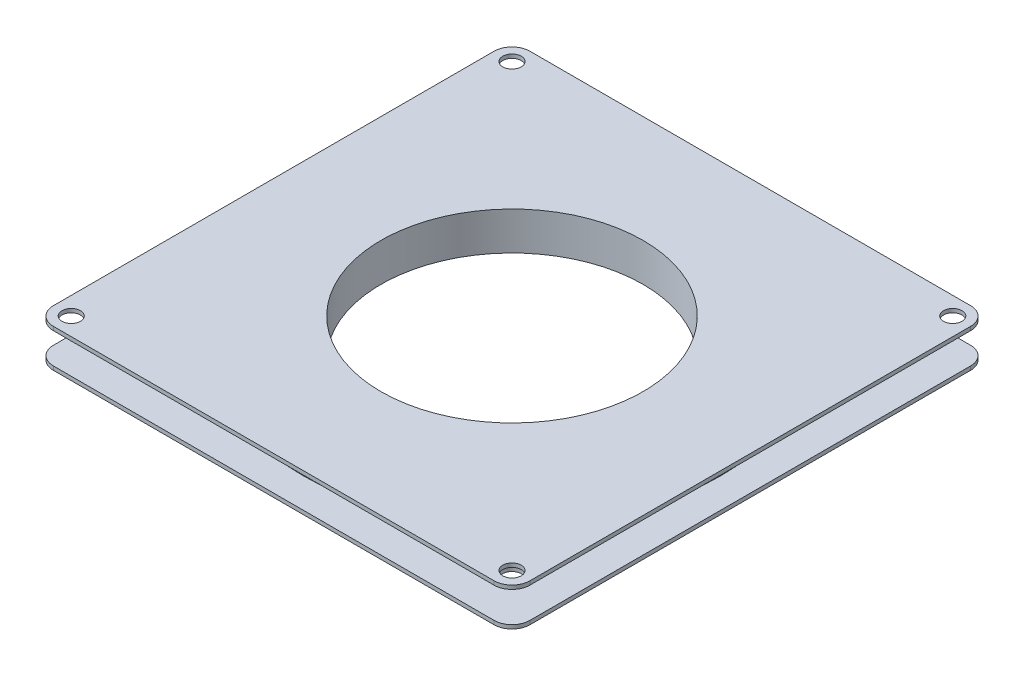
ISO-10303-21;
HEADER;
FILE_DESCRIPTION(('STEP AP214'),'2;1');
FILE_NAME('part.step','',(''),(''),'','','');
FILE_SCHEMA(('AUTOMOTIVE_DESIGN { 1 0 10303 214 1 1 1 1 }'));
ENDSEC;
DATA;
#1=APPLICATION_CONTEXT('core data for automotive mechanical design processes');
#2=APPLICATION_PROTOCOL_DEFINITION('international standard','automotive_design',2000,#1);
#3=PRODUCT_CONTEXT('',#1,'mechanical');
#4=PRODUCT('Part','Part','',(#3));
#5=PRODUCT_RELATED_PRODUCT_CATEGORY('part','',(#4));
#6=PRODUCT_DEFINITION_FORMATION('','',#4);
#7=PRODUCT_DEFINITION_CONTEXT('part definition',#1,'design');
#8=PRODUCT_DEFINITION('design','',#6,#7);
#9=PRODUCT_DEFINITION_SHAPE('','',#8);
#10=(LENGTH_UNIT() NAMED_UNIT(*) SI_UNIT(.MILLI.,.METRE.));
#11=(NAMED_UNIT(*) PLANE_ANGLE_UNIT() SI_UNIT($,.RADIAN.));
#12=(NAMED_UNIT(*) SI_UNIT($,.STERADIAN.) SOLID_ANGLE_UNIT());
#13=UNCERTAINTY_MEASURE_WITH_UNIT(LENGTH_MEASURE(1.E-05),#10,'distance_accuracy_value','');
#14=(GEOMETRIC_REPRESENTATION_CONTEXT(3) GLOBAL_UNCERTAINTY_ASSIGNED_CONTEXT((#13)) GLOBAL_UNIT_ASSIGNED_CONTEXT((#10,
#11,#12)) REPRESENTATION_CONTEXT('',''));
#15=CARTESIAN_POINT('',(0.,0.,0.));
#16=DIRECTION('',(0.,0.,1.));
#17=DIRECTION('',(1.,0.,0.));
#18=AXIS2_PLACEMENT_3D('',#15,#16,#17);
#19=CARTESIAN_POINT('',(0.,0.8128,0.));
#20=DIRECTION('',(0.,-1.,0.));
#21=DIRECTION('',(0.,0.,-1.));
#22=AXIS2_PLACEMENT_3D('',#19,#20,#21);
#23=PLANE('',#22);
#24=CARTESIAN_POINT('',(91.2495,0.8128,-10.3505));
#25=DIRECTION('',(0.,1.,0.));
#26=DIRECTION('',(0.,0.,1.));
#27=AXIS2_PLACEMENT_3D('',#24,#25,#26);
#28=CIRCLE('',#27,1.9685);
#29=CARTESIAN_POINT('',(91.2495,0.8128,-8.382));
#30=VERTEX_POINT('',#29);
#31=EDGE_CURVE('E231',#30,#30,#28,.T.);
#32=ORIENTED_EDGE('',*,*,#31,.F.);
#33=EDGE_LOOP('',(#32));
#34=FACE_BOUND('',#33,.T.);
#35=CARTESIAN_POINT('',(10.3505,0.8128,-10.3505));
#36=DIRECTION('',(0.,1.,0.));
#37=DIRECTION('',(0.,0.,1.));
#38=AXIS2_PLACEMENT_3D('',#35,#36,#37);
#39=CIRCLE('',#38,1.9685);
#40=CARTESIAN_POINT('',(10.3505,0.8128,-8.382));
#41=VERTEX_POINT('',#40);
#42=EDGE_CURVE('E243',#41,#41,#39,.T.);
#43=ORIENTED_EDGE('',*,*,#42,.F.);
#44=EDGE_LOOP('',(#43));
#45=FACE_BOUND('',#44,.T.);
#46=DIRECTION('',(1.,0.,0.));
#47=VECTOR('',#46,1.);
#48=CARTESIAN_POINT('',(0.,0.8128,0.));
#49=LINE('',#48,#47);
#50=CARTESIAN_POINT('',(3.81,0.8128,0.));
#51=VERTEX_POINT('',#50);
#52=CARTESIAN_POINT('',(97.79,0.8128,0.));
#53=VERTEX_POINT('',#52);
#54=EDGE_CURVE('E252',#51,#53,#49,.T.);
#55=ORIENTED_EDGE('',*,*,#54,.T.);
#56=CARTESIAN_POINT('',(97.79,0.8128,-3.81));
#57=DIRECTION('',(0.,-1.,0.));
#58=DIRECTION('',(0.,0.,-1.));
#59=AXIS2_PLACEMENT_3D('',#56,#57,#58);
#60=CIRCLE('',#59,3.81);
#61=CARTESIAN_POINT('',(101.6,0.8128,-3.81));
#62=VERTEX_POINT('',#61);
#63=EDGE_CURVE('E292',#53,#62,#60,.F.);
#64=ORIENTED_EDGE('',*,*,#63,.T.);
#65=DIRECTION('',(0.,0.,-1.));
#66=VECTOR('',#65,1.);
#67=CARTESIAN_POINT('',(101.6,0.8128,0.));
#68=LINE('',#67,#66);
#69=CARTESIAN_POINT('',(101.6,0.8128,-97.79));
#70=VERTEX_POINT('',#69);
#71=EDGE_CURVE('E256',#62,#70,#68,.T.);
#72=ORIENTED_EDGE('',*,*,#71,.T.);
#73=CARTESIAN_POINT('',(97.79,0.8128,-97.79));
#74=DIRECTION('',(0.,-1.,0.));
#75=DIRECTION('',(0.,0.,-1.));
#76=AXIS2_PLACEMENT_3D('',#73,#74,#75);
#77=CIRCLE('',#76,3.81);
#78=CARTESIAN_POINT('',(97.79,0.8128,-101.6));
#79=VERTEX_POINT('',#78);
#80=EDGE_CURVE('E61',#70,#79,#77,.F.);
#81=ORIENTED_EDGE('',*,*,#80,.T.);
#82=DIRECTION('',(-1.,0.,0.));
#83=VECTOR('',#82,1.);
#84=CARTESIAN_POINT('',(0.,0.8128,-101.6));
#85=LINE('',#84,#83);
#86=CARTESIAN_POINT('',(3.81,0.8128,-101.6));
#87=VERTEX_POINT('',#86);
#88=EDGE_CURVE('E258',#79,#87,#85,.T.);
#89=ORIENTED_EDGE('',*,*,#88,.T.);
#90=CARTESIAN_POINT('',(3.81,0.8128,-97.79));
#91=DIRECTION('',(0.,-1.,0.));
#92=DIRECTION('',(0.,0.,-1.));
#93=AXIS2_PLACEMENT_3D('',#90,#91,#92);
#94=CIRCLE('',#93,3.81);
#95=CARTESIAN_POINT('',(0.,0.8128,-97.79));
#96=VERTEX_POINT('',#95);
#97=EDGE_CURVE('E289',#87,#96,#94,.F.);
#98=ORIENTED_EDGE('',*,*,#97,.T.);
#99=DIRECTION('',(0.,0.,1.));
#100=VECTOR('',#99,1.);
#101=CARTESIAN_POINT('',(0.,0.8128,0.));
#102=LINE('',#101,#100);
#103=CARTESIAN_POINT('',(0.,0.8128,-3.81));
#104=VERTEX_POINT('',#103);
#105=EDGE_CURVE('E249',#96,#104,#102,.T.);
#106=ORIENTED_EDGE('',*,*,#105,.T.);
#107=CARTESIAN_POINT('',(3.81,0.8128,-3.81));
#108=DIRECTION('',(0.,-1.,0.));
#109=DIRECTION('',(0.,0.,-1.));
#110=AXIS2_PLACEMENT_3D('',#107,#108,#109);
#111=CIRCLE('',#110,3.81);
#112=EDGE_CURVE('E287',#104,#51,#111,.F.);
#113=ORIENTED_EDGE('',*,*,#112,.T.);
#114=EDGE_LOOP('',(#55,#64,#72,#81,#89,#98,#106,#113));
#115=FACE_BOUND('',#114,.T.);
#116=CARTESIAN_POINT('',(10.3505,0.8128,-91.2495));
#117=DIRECTION('',(0.,1.,0.));
#118=DIRECTION('',(0.,0.,1.));
#119=AXIS2_PLACEMENT_3D('',#116,#117,#118);
#120=CIRCLE('',#119,1.96850000000001);
#121=CARTESIAN_POINT('',(10.3505,0.8128,-89.281));
#122=VERTEX_POINT('',#121);
#123=EDGE_CURVE('E237',#122,#122,#120,.T.);
#124=ORIENTED_EDGE('',*,*,#123,.F.);
#125=EDGE_LOOP('',(#124));
#126=FACE_BOUND('',#125,.T.);
#127=CARTESIAN_POINT('',(91.2495,0.8128,-91.2495));
#128=DIRECTION('',(0.,1.,0.));
#129=DIRECTION('',(0.,0.,1.));
#130=AXIS2_PLACEMENT_3D('',#127,#128,#129);
#131=CIRCLE('',#130,1.9685);
#132=CARTESIAN_POINT('',(91.2495,0.8128,-89.281));
#133=VERTEX_POINT('',#132);
#134=EDGE_CURVE('E225',#133,#133,#131,.T.);
#135=ORIENTED_EDGE('',*,*,#134,.F.);
#136=EDGE_LOOP('',(#135));
#137=FACE_BOUND('',#136,.T.);
#138=CARTESIAN_POINT('',(50.8,0.812800000005609,-50.8));
#139=DIRECTION('',(0.,-1.,0.));
#140=DIRECTION('',(0.,0.,-1.));
#141=AXIS2_PLACEMENT_3D('',#138,#139,#140);
#142=CIRCLE('',#141,44.45);
#143=CARTESIAN_POINT('',(50.8,0.812800000005609,-95.25));
#144=VERTEX_POINT('',#143);
#145=EDGE_CURVE('E12',#144,#144,#142,.F.);
#146=ORIENTED_EDGE('',*,*,#145,.F.);
#147=EDGE_LOOP('',(#146));
#148=FACE_BOUND('',#147,.T.);
#149=ADVANCED_FACE('F39',(#34,#45,#115,#126,#137,#148),#23,.F.);
#150=CARTESIAN_POINT('',(0.,0.,0.));
#151=DIRECTION('',(0.,-1.,0.));
#152=DIRECTION('',(0.,0.,-1.));
#153=AXIS2_PLACEMENT_3D('',#150,#151,#152);
#154=PLANE('',#153);
#155=CARTESIAN_POINT('',(91.2495,0.,-91.2495));
#156=DIRECTION('',(0.,1.,0.));
#157=DIRECTION('',(0.,0.,1.));
#158=AXIS2_PLACEMENT_3D('',#155,#156,#157);
#159=CIRCLE('',#158,1.9685);
#160=CARTESIAN_POINT('',(91.2495,0.,-89.281));
#161=VERTEX_POINT('',#160);
#162=EDGE_CURVE('E224',#161,#161,#159,.T.);
#163=ORIENTED_EDGE('',*,*,#162,.T.);
#164=EDGE_LOOP('',(#163));
#165=FACE_BOUND('',#164,.T.);
#166=CARTESIAN_POINT('',(10.3505,0.,-91.2495));
#167=DIRECTION('',(0.,1.,0.));
#168=DIRECTION('',(0.,0.,1.));
#169=AXIS2_PLACEMENT_3D('',#166,#167,#168);
#170=CIRCLE('',#169,1.96850000000001);
#171=CARTESIAN_POINT('',(10.3505,0.,-89.281));
#172=VERTEX_POINT('',#171);
#173=EDGE_CURVE('E234',#172,#172,#170,.T.);
#174=ORIENTED_EDGE('',*,*,#173,.T.);
#175=EDGE_LOOP('',(#174));
#176=FACE_BOUND('',#175,.T.);
#177=DIRECTION('',(0.,0.,-1.));
#178=VECTOR('',#177,1.);
#179=CARTESIAN_POINT('',(101.6,0.,0.));
#180=LINE('',#179,#178);
#181=CARTESIAN_POINT('',(101.6,0.,-3.81));
#182=VERTEX_POINT('',#181);
#183=CARTESIAN_POINT('',(101.6,0.,-97.79));
#184=VERTEX_POINT('',#183);
#185=EDGE_CURVE('E266',#182,#184,#180,.T.);
#186=ORIENTED_EDGE('',*,*,#185,.F.);
#187=CARTESIAN_POINT('',(97.79,0.,-3.81));
#188=DIRECTION('',(0.,-1.,0.));
#189=DIRECTION('',(0.,0.,-1.));
#190=AXIS2_PLACEMENT_3D('',#187,#188,#189);
#191=CIRCLE('',#190,3.81);
#192=CARTESIAN_POINT('',(97.79,0.,0.));
#193=VERTEX_POINT('',#192);
#194=EDGE_CURVE('E280',#182,#193,#191,.T.);
#195=ORIENTED_EDGE('',*,*,#194,.T.);
#196=DIRECTION('',(1.,0.,0.));
#197=VECTOR('',#196,1.);
#198=CARTESIAN_POINT('',(0.,0.,0.));
#199=LINE('',#198,#197);
#200=CARTESIAN_POINT('',(3.81,0.,0.));
#201=VERTEX_POINT('',#200);
#202=EDGE_CURVE('E263',#201,#193,#199,.T.);
#203=ORIENTED_EDGE('',*,*,#202,.F.);
#204=CARTESIAN_POINT('',(3.81,0.,-3.81));
#205=DIRECTION('',(0.,-1.,0.));
#206=DIRECTION('',(0.,0.,-1.));
#207=AXIS2_PLACEMENT_3D('',#204,#205,#206);
#208=CIRCLE('',#207,3.81);
#209=CARTESIAN_POINT('',(0.,0.,-3.81));
#210=VERTEX_POINT('',#209);
#211=EDGE_CURVE('E274',#201,#210,#208,.T.);
#212=ORIENTED_EDGE('',*,*,#211,.T.);
#213=DIRECTION('',(0.,0.,1.));
#214=VECTOR('',#213,1.);
#215=CARTESIAN_POINT('',(0.,0.,0.));
#216=LINE('',#215,#214);
#217=CARTESIAN_POINT('',(0.,0.,-97.79));
#218=VERTEX_POINT('',#217);
#219=EDGE_CURVE('E246',#218,#210,#216,.T.);
#220=ORIENTED_EDGE('',*,*,#219,.F.);
#221=CARTESIAN_POINT('',(3.81,0.,-97.79));
#222=DIRECTION('',(0.,-1.,0.));
#223=DIRECTION('',(0.,0.,-1.));
#224=AXIS2_PLACEMENT_3D('',#221,#222,#223);
#225=CIRCLE('',#224,3.81);
#226=CARTESIAN_POINT('',(3.81,0.,-101.6));
#227=VERTEX_POINT('',#226);
#228=EDGE_CURVE('E276',#218,#227,#225,.T.);
#229=ORIENTED_EDGE('',*,*,#228,.T.);
#230=DIRECTION('',(-1.,0.,0.));
#231=VECTOR('',#230,1.);
#232=CARTESIAN_POINT('',(0.,0.,-101.6));
#233=LINE('',#232,#231);
#234=CARTESIAN_POINT('',(97.79,0.,-101.6));
#235=VERTEX_POINT('',#234);
#236=EDGE_CURVE('E253',#235,#227,#233,.T.);
#237=ORIENTED_EDGE('',*,*,#236,.F.);
#238=CARTESIAN_POINT('',(97.79,0.,-97.79));
#239=DIRECTION('',(0.,-1.,0.));
#240=DIRECTION('',(0.,0.,-1.));
#241=AXIS2_PLACEMENT_3D('',#238,#239,#240);
#242=CIRCLE('',#241,3.81);
#243=EDGE_CURVE('E278',#235,#184,#242,.T.);
#244=ORIENTED_EDGE('',*,*,#243,.T.);
#245=EDGE_LOOP('',(#186,#195,#203,#212,#220,#229,#237,#244));
#246=FACE_BOUND('',#245,.T.);
#247=CARTESIAN_POINT('',(10.3505,0.,-10.3505));
#248=DIRECTION('',(0.,1.,0.));
#249=DIRECTION('',(0.,0.,1.));
#250=AXIS2_PLACEMENT_3D('',#247,#248,#249);
#251=CIRCLE('',#250,1.9685);
#252=CARTESIAN_POINT('',(10.3505,0.,-8.382));
#253=VERTEX_POINT('',#252);
#254=EDGE_CURVE('E240',#253,#253,#251,.T.);
#255=ORIENTED_EDGE('',*,*,#254,.T.);
#256=EDGE_LOOP('',(#255));
#257=FACE_BOUND('',#256,.T.);
#258=CARTESIAN_POINT('',(91.2495,0.,-10.3505));
#259=DIRECTION('',(0.,1.,0.));
#260=DIRECTION('',(0.,0.,1.));
#261=AXIS2_PLACEMENT_3D('',#258,#259,#260);
#262=CIRCLE('',#261,1.9685);
#263=CARTESIAN_POINT('',(91.2495,0.,-8.382));
#264=VERTEX_POINT('',#263);
#265=EDGE_CURVE('E228',#264,#264,#262,.T.);
#266=ORIENTED_EDGE('',*,*,#265,.T.);
#267=EDGE_LOOP('',(#266));
#268=FACE_BOUND('',#267,.T.);
#269=CARTESIAN_POINT('',(50.8,0.,-50.8));
#270=DIRECTION('',(0.,1.,0.));
#271=DIRECTION('',(0.,0.,1.));
#272=AXIS2_PLACEMENT_3D('',#269,#270,#271);
#273=CIRCLE('',#272,27.94);
#274=CARTESIAN_POINT('',(50.8,0.,-22.86));
#275=VERTEX_POINT('',#274);
#276=EDGE_CURVE('E221',#275,#275,#273,.T.);
#277=ORIENTED_EDGE('',*,*,#276,.T.);
#278=EDGE_LOOP('',(#277));
#279=FACE_BOUND('',#278,.T.);
#280=ADVANCED_FACE('F310',(#165,#176,#246,#257,#268,#279),#154,.T.);
#281=CARTESIAN_POINT('',(0.,0.8128,0.));
#282=DIRECTION('',(1.,0.,0.));
#283=DIRECTION('',(0.,0.,-1.));
#284=AXIS2_PLACEMENT_3D('',#281,#282,#283);
#285=PLANE('',#284);
#286=ORIENTED_EDGE('',*,*,#105,.F.);
#287=DIRECTION('',(0.,-1.,0.));
#288=VECTOR('',#287,1.);
#289=CARTESIAN_POINT('',(0.,0.8128,-97.79));
#290=LINE('',#289,#288);
#291=EDGE_CURVE('E47',#96,#218,#290,.T.);
#292=ORIENTED_EDGE('',*,*,#291,.T.);
#293=ORIENTED_EDGE('',*,*,#219,.T.);
#294=DIRECTION('',(0.,-1.,0.));
#295=VECTOR('',#294,1.);
#296=CARTESIAN_POINT('',(0.,0.8128,-3.81));
#297=LINE('',#296,#295);
#298=EDGE_CURVE('E298',#210,#104,#297,.F.);
#299=ORIENTED_EDGE('',*,*,#298,.T.);
#300=EDGE_LOOP('',(#286,#292,#293,#299));
#301=FACE_BOUND('',#300,.T.);
#302=ADVANCED_FACE('F304',(#301),#285,.F.);
#303=CARTESIAN_POINT('',(0.,0.8128,0.));
#304=DIRECTION('',(0.,0.,-1.));
#305=DIRECTION('',(-1.,0.,0.));
#306=AXIS2_PLACEMENT_3D('',#303,#304,#305);
#307=PLANE('',#306);
#308=ORIENTED_EDGE('',*,*,#202,.T.);
#309=DIRECTION('',(0.,-1.,0.));
#310=VECTOR('',#309,1.);
#311=CARTESIAN_POINT('',(97.79,0.8128,0.));
#312=LINE('',#311,#310);
#313=EDGE_CURVE('E285',#193,#53,#312,.F.);
#314=ORIENTED_EDGE('',*,*,#313,.T.);
#315=ORIENTED_EDGE('',*,*,#54,.F.);
#316=DIRECTION('',(0.,-1.,0.));
#317=VECTOR('',#316,1.);
#318=CARTESIAN_POINT('',(3.81,0.8128,0.));
#319=LINE('',#318,#317);
#320=EDGE_CURVE('E282',#51,#201,#319,.T.);
#321=ORIENTED_EDGE('',*,*,#320,.T.);
#322=EDGE_LOOP('',(#308,#314,#315,#321));
#323=FACE_BOUND('',#322,.T.);
#324=ADVANCED_FACE('F319',(#323),#307,.F.);
#325=CARTESIAN_POINT('',(101.6,0.8128,0.));
#326=DIRECTION('',(-1.,0.,0.));
#327=DIRECTION('',(0.,0.,1.));
#328=AXIS2_PLACEMENT_3D('',#325,#326,#327);
#329=PLANE('',#328);
#330=ORIENTED_EDGE('',*,*,#71,.F.);
#331=DIRECTION('',(0.,-1.,0.));
#332=VECTOR('',#331,1.);
#333=CARTESIAN_POINT('',(101.6,0.8128,-3.81));
#334=LINE('',#333,#332);
#335=EDGE_CURVE('E271',#62,#182,#334,.T.);
#336=ORIENTED_EDGE('',*,*,#335,.T.);
#337=ORIENTED_EDGE('',*,*,#185,.T.);
#338=DIRECTION('',(0.,-1.,0.));
#339=VECTOR('',#338,1.);
#340=CARTESIAN_POINT('',(101.6,0.8128,-97.79));
#341=LINE('',#340,#339);
#342=EDGE_CURVE('E260',#184,#70,#341,.F.);
#343=ORIENTED_EDGE('',*,*,#342,.T.);
#344=EDGE_LOOP('',(#330,#336,#337,#343));
#345=FACE_BOUND('',#344,.T.);
#346=ADVANCED_FACE('F328',(#345),#329,.F.);
#347=CARTESIAN_POINT('',(0.,0.8128,-101.6));
#348=DIRECTION('',(0.,0.,1.));
#349=DIRECTION('',(1.,0.,0.));
#350=AXIS2_PLACEMENT_3D('',#347,#348,#349);
#351=PLANE('',#350);
#352=ORIENTED_EDGE('',*,*,#88,.F.);
#353=DIRECTION('',(0.,-1.,0.));
#354=VECTOR('',#353,1.);
#355=CARTESIAN_POINT('',(97.79,0.8128,-101.6));
#356=LINE('',#355,#354);
#357=EDGE_CURVE('E295',#79,#235,#356,.T.);
#358=ORIENTED_EDGE('',*,*,#357,.T.);
#359=ORIENTED_EDGE('',*,*,#236,.T.);
#360=DIRECTION('',(0.,-1.,0.));
#361=VECTOR('',#360,1.);
#362=CARTESIAN_POINT('',(3.81,0.8128,-101.6));
#363=LINE('',#362,#361);
#364=EDGE_CURVE('E54',#227,#87,#363,.F.);
#365=ORIENTED_EDGE('',*,*,#364,.T.);
#366=EDGE_LOOP('',(#352,#358,#359,#365));
#367=FACE_BOUND('',#366,.T.);
#368=ADVANCED_FACE('F333',(#367),#351,.F.);
#369=CARTESIAN_POINT('',(10.3505,0.8128,-10.3505));
#370=DIRECTION('',(0.,-1.,0.));
#371=DIRECTION('',(0.,0.,-1.));
#372=AXIS2_PLACEMENT_3D('',#369,#370,#371);
#373=CYLINDRICAL_SURFACE('',#372,1.9685);
#374=ORIENTED_EDGE('',*,*,#42,.T.);
#375=EDGE_LOOP('',(#374));
#376=FACE_BOUND('',#375,.T.);
#377=ORIENTED_EDGE('',*,*,#254,.F.);
#378=EDGE_LOOP('',(#377));
#379=FACE_BOUND('',#378,.T.);
#380=ADVANCED_FACE('F353',(#376,#379),#373,.F.);
#381=CARTESIAN_POINT('',(10.3505,0.8128,-91.2495));
#382=DIRECTION('',(0.,-1.,0.));
#383=DIRECTION('',(0.,0.,-1.));
#384=AXIS2_PLACEMENT_3D('',#381,#382,#383);
#385=CYLINDRICAL_SURFACE('',#384,1.96850000000001);
#386=ORIENTED_EDGE('',*,*,#123,.T.);
#387=EDGE_LOOP('',(#386));
#388=FACE_BOUND('',#387,.T.);
#389=ORIENTED_EDGE('',*,*,#173,.F.);
#390=EDGE_LOOP('',(#389));
#391=FACE_BOUND('',#390,.T.);
#392=ADVANCED_FACE('F384',(#388,#391),#385,.F.);
#393=CARTESIAN_POINT('',(91.2495,0.8128,-10.3505));
#394=DIRECTION('',(0.,-1.,0.));
#395=DIRECTION('',(0.,0.,-1.));
#396=AXIS2_PLACEMENT_3D('',#393,#394,#395);
#397=CYLINDRICAL_SURFACE('',#396,1.9685);
#398=ORIENTED_EDGE('',*,*,#31,.T.);
#399=EDGE_LOOP('',(#398));
#400=FACE_BOUND('',#399,.T.);
#401=ORIENTED_EDGE('',*,*,#265,.F.);
#402=EDGE_LOOP('',(#401));
#403=FACE_BOUND('',#402,.T.);
#404=ADVANCED_FACE('F375',(#400,#403),#397,.F.);
#405=CARTESIAN_POINT('',(91.2495,0.8128,-91.2495));
#406=DIRECTION('',(0.,-1.,0.));
#407=DIRECTION('',(0.,0.,-1.));
#408=AXIS2_PLACEMENT_3D('',#405,#406,#407);
#409=CYLINDRICAL_SURFACE('',#408,1.9685);
#410=ORIENTED_EDGE('',*,*,#134,.T.);
#411=EDGE_LOOP('',(#410));
#412=FACE_BOUND('',#411,.T.);
#413=ORIENTED_EDGE('',*,*,#162,.F.);
#414=EDGE_LOOP('',(#413));
#415=FACE_BOUND('',#414,.T.);
#416=ADVANCED_FACE('F369',(#412,#415),#409,.F.);
#417=CARTESIAN_POINT('',(50.8,0.8128,-50.8));
#418=DIRECTION('',(0.,-1.,0.));
#419=DIRECTION('',(0.,0.,-1.));
#420=AXIS2_PLACEMENT_3D('',#417,#418,#419);
#421=CYLINDRICAL_SURFACE('',#420,27.94);
#422=ORIENTED_EDGE('',*,*,#276,.F.);
#423=EDGE_LOOP('',(#422));
#424=FACE_BOUND('',#423,.T.);
#425=CARTESIAN_POINT('',(50.8,8.128,-50.8));
#426=DIRECTION('',(0.,1.,0.));
#427=DIRECTION('',(0.,0.,1.));
#428=AXIS2_PLACEMENT_3D('',#425,#426,#427);
#429=CIRCLE('',#428,27.94);
#430=CARTESIAN_POINT('',(50.8,8.128,-22.86));
#431=VERTEX_POINT('',#430);
#432=EDGE_CURVE('E467',#431,#431,#429,.T.);
#433=ORIENTED_EDGE('',*,*,#432,.T.);
#434=EDGE_LOOP('',(#433));
#435=FACE_BOUND('',#434,.T.);
#436=ADVANCED_FACE('F365',(#424,#435),#421,.F.);
#437=CARTESIAN_POINT('',(97.79,0.8128,-3.81));
#438=DIRECTION('',(0.,-1.,0.));
#439=DIRECTION('',(0.,0.,-1.));
#440=AXIS2_PLACEMENT_3D('',#437,#438,#439);
#441=CYLINDRICAL_SURFACE('',#440,3.81);
#442=ORIENTED_EDGE('',*,*,#63,.F.);
#443=ORIENTED_EDGE('',*,*,#313,.F.);
#444=ORIENTED_EDGE('',*,*,#194,.F.);
#445=ORIENTED_EDGE('',*,*,#335,.F.);
#446=EDGE_LOOP('',(#442,#443,#444,#445));
#447=FACE_BOUND('',#446,.T.);
#448=ADVANCED_FACE('F326',(#447),#441,.T.);
#449=CARTESIAN_POINT('',(97.79,0.8128,-97.79));
#450=DIRECTION('',(0.,-1.,0.));
#451=DIRECTION('',(0.,0.,-1.));
#452=AXIS2_PLACEMENT_3D('',#449,#450,#451);
#453=CYLINDRICAL_SURFACE('',#452,3.81);
#454=ORIENTED_EDGE('',*,*,#80,.F.);
#455=ORIENTED_EDGE('',*,*,#342,.F.);
#456=ORIENTED_EDGE('',*,*,#243,.F.);
#457=ORIENTED_EDGE('',*,*,#357,.F.);
#458=EDGE_LOOP('',(#454,#455,#456,#457));
#459=FACE_BOUND('',#458,.T.);
#460=ADVANCED_FACE('F332',(#459),#453,.T.);
#461=CARTESIAN_POINT('',(3.81,0.8128,-97.79));
#462=DIRECTION('',(0.,-1.,0.));
#463=DIRECTION('',(0.,0.,-1.));
#464=AXIS2_PLACEMENT_3D('',#461,#462,#463);
#465=CYLINDRICAL_SURFACE('',#464,3.81);
#466=ORIENTED_EDGE('',*,*,#97,.F.);
#467=ORIENTED_EDGE('',*,*,#364,.F.);
#468=ORIENTED_EDGE('',*,*,#228,.F.);
#469=ORIENTED_EDGE('',*,*,#291,.F.);
#470=EDGE_LOOP('',(#466,#467,#468,#469));
#471=FACE_BOUND('',#470,.T.);
#472=ADVANCED_FACE('F334',(#471),#465,.T.);
#473=CARTESIAN_POINT('',(3.81,0.8128,-3.81));
#474=DIRECTION('',(0.,-1.,0.));
#475=DIRECTION('',(0.,0.,-1.));
#476=AXIS2_PLACEMENT_3D('',#473,#474,#475);
#477=CYLINDRICAL_SURFACE('',#476,3.81);
#478=ORIENTED_EDGE('',*,*,#112,.F.);
#479=ORIENTED_EDGE('',*,*,#298,.F.);
#480=ORIENTED_EDGE('',*,*,#211,.F.);
#481=ORIENTED_EDGE('',*,*,#320,.F.);
#482=EDGE_LOOP('',(#478,#479,#480,#481));
#483=FACE_BOUND('',#482,.T.);
#484=ADVANCED_FACE('F41',(#483),#477,.T.);
#485=CARTESIAN_POINT('',(50.8,500000.,-50.8));
#486=DIRECTION('',(0.,-1.,0.));
#487=DIRECTION('',(0.,0.,-1.));
#488=AXIS2_PLACEMENT_3D('',#485,#486,#487);
#489=CYLINDRICAL_SURFACE('',#488,44.45);
#490=CARTESIAN_POINT('',(50.8,7.31519999999364,-50.8));
#491=DIRECTION('',(0.,-1.,0.));
#492=DIRECTION('',(0.,0.,-1.));
#493=AXIS2_PLACEMENT_3D('',#490,#491,#492);
#494=CIRCLE('',#493,44.45);
#495=CARTESIAN_POINT('',(50.8,7.31519999999364,-95.25));
#496=VERTEX_POINT('',#495);
#497=EDGE_CURVE('E218',#496,#496,#494,.T.);
#498=ORIENTED_EDGE('',*,*,#497,.T.);
#499=EDGE_LOOP('',(#498));
#500=FACE_BOUND('',#499,.T.);
#501=ORIENTED_EDGE('',*,*,#145,.T.);
#502=EDGE_LOOP('',(#501));
#503=FACE_BOUND('',#502,.T.);
#504=ADVANCED_FACE('F340',(#500,#503),#489,.T.);
#505=CARTESIAN_POINT('',(0.,7.3152,0.));
#506=DIRECTION('',(0.,-1.,0.));
#507=DIRECTION('',(0.,0.,-1.));
#508=AXIS2_PLACEMENT_3D('',#505,#506,#507);
#509=PLANE('',#508);
#510=CARTESIAN_POINT('',(97.79,7.3152,-3.81));
#511=DIRECTION('',(0.,1.,0.));
#512=DIRECTION('',(0.,0.,1.));
#513=AXIS2_PLACEMENT_3D('',#510,#511,#512);
#514=CIRCLE('',#513,1.9685);
#515=CARTESIAN_POINT('',(97.79,7.3152,-1.8415));
#516=VERTEX_POINT('',#515);
#517=EDGE_CURVE('E491',#516,#516,#514,.T.);
#518=ORIENTED_EDGE('',*,*,#517,.T.);
#519=EDGE_LOOP('',(#518));
#520=FACE_BOUND('',#519,.T.);
#521=CARTESIAN_POINT('',(3.81,7.3152,-97.79));
#522=DIRECTION('',(0.,1.,0.));
#523=DIRECTION('',(0.,0.,1.));
#524=AXIS2_PLACEMENT_3D('',#521,#522,#523);
#525=CIRCLE('',#524,1.9685);
#526=CARTESIAN_POINT('',(3.81,7.3152,-95.8215));
#527=VERTEX_POINT('',#526);
#528=EDGE_CURVE('E479',#527,#527,#525,.T.);
#529=ORIENTED_EDGE('',*,*,#528,.T.);
#530=EDGE_LOOP('',(#529));
#531=FACE_BOUND('',#530,.T.);
#532=DIRECTION('',(0.,0.,-1.));
#533=VECTOR('',#532,1.);
#534=CARTESIAN_POINT('',(101.6,7.3152,0.));
#535=LINE('',#534,#533);
#536=CARTESIAN_POINT('',(101.6,7.3152,-3.81));
#537=VERTEX_POINT('',#536);
#538=CARTESIAN_POINT('',(101.6,7.3152,-97.79));
#539=VERTEX_POINT('',#538);
#540=EDGE_CURVE('E171',#537,#539,#535,.T.);
#541=ORIENTED_EDGE('',*,*,#540,.F.);
#542=CARTESIAN_POINT('',(97.79,7.3152,-3.81));
#543=DIRECTION('',(0.,-1.,0.));
#544=DIRECTION('',(0.,0.,-1.));
#545=AXIS2_PLACEMENT_3D('',#542,#543,#544);
#546=CIRCLE('',#545,3.81);
#547=CARTESIAN_POINT('',(97.79,7.3152,0.));
#548=VERTEX_POINT('',#547);
#549=EDGE_CURVE('E154',#537,#548,#546,.T.);
#550=ORIENTED_EDGE('',*,*,#549,.T.);
#551=DIRECTION('',(1.,0.,0.));
#552=VECTOR('',#551,1.);
#553=CARTESIAN_POINT('',(0.,7.3152,0.));
#554=LINE('',#553,#552);
#555=CARTESIAN_POINT('',(3.81,7.3152,0.));
#556=VERTEX_POINT('',#555);
#557=EDGE_CURVE('E182',#556,#548,#554,.T.);
#558=ORIENTED_EDGE('',*,*,#557,.F.);
#559=CARTESIAN_POINT('',(3.81,7.3152,-3.81));
#560=DIRECTION('',(0.,-1.,0.));
#561=DIRECTION('',(0.,0.,-1.));
#562=AXIS2_PLACEMENT_3D('',#559,#560,#561);
#563=CIRCLE('',#562,3.81);
#564=CARTESIAN_POINT('',(0.,7.3152,-3.81));
#565=VERTEX_POINT('',#564);
#566=EDGE_CURVE('E175',#556,#565,#563,.T.);
#567=ORIENTED_EDGE('',*,*,#566,.T.);
#568=DIRECTION('',(0.,0.,1.));
#569=VECTOR('',#568,1.);
#570=CARTESIAN_POINT('',(0.,7.3152,0.));
#571=LINE('',#570,#569);
#572=CARTESIAN_POINT('',(0.,7.3152,-97.79));
#573=VERTEX_POINT('',#572);
#574=EDGE_CURVE('E187',#573,#565,#571,.T.);
#575=ORIENTED_EDGE('',*,*,#574,.F.);
#576=CARTESIAN_POINT('',(3.81,7.3152,-97.79));
#577=DIRECTION('',(0.,-1.,0.));
#578=DIRECTION('',(0.,0.,-1.));
#579=AXIS2_PLACEMENT_3D('',#576,#577,#578);
#580=CIRCLE('',#579,3.81);
#581=CARTESIAN_POINT('',(3.81,7.3152,-101.6));
#582=VERTEX_POINT('',#581);
#583=EDGE_CURVE('E194',#573,#582,#580,.T.);
#584=ORIENTED_EDGE('',*,*,#583,.T.);
#585=DIRECTION('',(-1.,0.,0.));
#586=VECTOR('',#585,1.);
#587=CARTESIAN_POINT('',(0.,7.3152,-101.6));
#588=LINE('',#587,#586);
#589=CARTESIAN_POINT('',(97.79,7.3152,-101.6));
#590=VERTEX_POINT('',#589);
#591=EDGE_CURVE('E181',#590,#582,#588,.T.);
#592=ORIENTED_EDGE('',*,*,#591,.F.);
#593=CARTESIAN_POINT('',(97.79,7.3152,-97.79));
#594=DIRECTION('',(0.,-1.,0.));
#595=DIRECTION('',(0.,0.,-1.));
#596=AXIS2_PLACEMENT_3D('',#593,#594,#595);
#597=CIRCLE('',#596,3.81);
#598=EDGE_CURVE('E165',#590,#539,#597,.T.);
#599=ORIENTED_EDGE('',*,*,#598,.T.);
#600=EDGE_LOOP('',(#541,#550,#558,#567,#575,#584,#592,#599));
#601=FACE_BOUND('',#600,.T.);
#602=CARTESIAN_POINT('',(3.81,7.3152,-3.81));
#603=DIRECTION('',(0.,1.,0.));
#604=DIRECTION('',(0.,0.,1.));
#605=AXIS2_PLACEMENT_3D('',#602,#603,#604);
#606=CIRCLE('',#605,1.9685);
#607=CARTESIAN_POINT('',(3.81,7.3152,-1.8415));
#608=VERTEX_POINT('',#607);
#609=EDGE_CURVE('E473',#608,#608,#606,.T.);
#610=ORIENTED_EDGE('',*,*,#609,.T.);
#611=EDGE_LOOP('',(#610));
#612=FACE_BOUND('',#611,.T.);
#613=CARTESIAN_POINT('',(97.79,7.3152,-97.79));
#614=DIRECTION('',(0.,1.,0.));
#615=DIRECTION('',(0.,0.,1.));
#616=AXIS2_PLACEMENT_3D('',#613,#614,#615);
#617=CIRCLE('',#616,1.9685);
#618=CARTESIAN_POINT('',(97.79,7.3152,-95.8215));
#619=VERTEX_POINT('',#618);
#620=EDGE_CURVE('E485',#619,#619,#617,.T.);
#621=ORIENTED_EDGE('',*,*,#620,.T.);
#622=EDGE_LOOP('',(#621));
#623=FACE_BOUND('',#622,.T.);
#624=ORIENTED_EDGE('',*,*,#497,.F.);
#625=EDGE_LOOP('',(#624));
#626=FACE_BOUND('',#625,.T.);
#627=ADVANCED_FACE('F178',(#520,#531,#601,#612,#623,#626),#509,.T.);
#628=CARTESIAN_POINT('',(0.,8.128,0.));
#629=DIRECTION('',(0.,-1.,0.));
#630=DIRECTION('',(0.,0.,-1.));
#631=AXIS2_PLACEMENT_3D('',#628,#629,#630);
#632=PLANE('',#631);
#633=CARTESIAN_POINT('',(97.79,8.128,-97.79));
#634=DIRECTION('',(0.,1.,0.));
#635=DIRECTION('',(0.,0.,1.));
#636=AXIS2_PLACEMENT_3D('',#633,#634,#635);
#637=CIRCLE('',#636,1.9685);
#638=CARTESIAN_POINT('',(97.79,8.128,-95.8215));
#639=VERTEX_POINT('',#638);
#640=EDGE_CURVE('E482',#639,#639,#637,.T.);
#641=ORIENTED_EDGE('',*,*,#640,.F.);
#642=EDGE_LOOP('',(#641));
#643=FACE_BOUND('',#642,.T.);
#644=CARTESIAN_POINT('',(3.81,8.128,-3.81));
#645=DIRECTION('',(0.,1.,0.));
#646=DIRECTION('',(0.,0.,1.));
#647=AXIS2_PLACEMENT_3D('',#644,#645,#646);
#648=CIRCLE('',#647,1.9685);
#649=CARTESIAN_POINT('',(3.81,8.128,-1.8415));
#650=VERTEX_POINT('',#649);
#651=EDGE_CURVE('E470',#650,#650,#648,.T.);
#652=ORIENTED_EDGE('',*,*,#651,.F.);
#653=EDGE_LOOP('',(#652));
#654=FACE_BOUND('',#653,.T.);
#655=DIRECTION('',(1.,0.,0.));
#656=VECTOR('',#655,1.);
#657=CARTESIAN_POINT('',(0.,8.128,0.));
#658=LINE('',#657,#656);
#659=CARTESIAN_POINT('',(3.81,8.128,0.));
#660=VERTEX_POINT('',#659);
#661=CARTESIAN_POINT('',(97.79,8.128,0.));
#662=VERTEX_POINT('',#661);
#663=EDGE_CURVE('E458',#660,#662,#658,.T.);
#664=ORIENTED_EDGE('',*,*,#663,.T.);
#665=CARTESIAN_POINT('',(97.79,8.128,-3.81));
#666=DIRECTION('',(0.,-1.,0.));
#667=DIRECTION('',(0.,0.,-1.));
#668=AXIS2_PLACEMENT_3D('',#665,#666,#667);
#669=CIRCLE('',#668,3.81);
#670=CARTESIAN_POINT('',(101.6,8.128,-3.81));
#671=VERTEX_POINT('',#670);
#672=EDGE_CURVE('E206',#662,#671,#669,.F.);
#673=ORIENTED_EDGE('',*,*,#672,.T.);
#674=DIRECTION('',(0.,0.,-1.));
#675=VECTOR('',#674,1.);
#676=CARTESIAN_POINT('',(101.6,8.128,0.));
#677=LINE('',#676,#675);
#678=CARTESIAN_POINT('',(101.6,8.128,-97.79));
#679=VERTEX_POINT('',#678);
#680=EDGE_CURVE('E174',#671,#679,#677,.T.);
#681=ORIENTED_EDGE('',*,*,#680,.T.);
#682=CARTESIAN_POINT('',(97.79,8.128,-97.79));
#683=DIRECTION('',(0.,-1.,0.));
#684=DIRECTION('',(0.,0.,-1.));
#685=AXIS2_PLACEMENT_3D('',#682,#683,#684);
#686=CIRCLE('',#685,3.81);
#687=CARTESIAN_POINT('',(97.79,8.128,-101.6));
#688=VERTEX_POINT('',#687);
#689=EDGE_CURVE('E204',#679,#688,#686,.F.);
#690=ORIENTED_EDGE('',*,*,#689,.T.);
#691=DIRECTION('',(-1.,0.,0.));
#692=VECTOR('',#691,1.);
#693=CARTESIAN_POINT('',(0.,8.128,-101.6));
#694=LINE('',#693,#692);
#695=CARTESIAN_POINT('',(3.81,8.128,-101.6));
#696=VERTEX_POINT('',#695);
#697=EDGE_CURVE('E191',#688,#696,#694,.T.);
#698=ORIENTED_EDGE('',*,*,#697,.T.);
#699=CARTESIAN_POINT('',(3.81,8.128,-97.79));
#700=DIRECTION('',(0.,-1.,0.));
#701=DIRECTION('',(0.,0.,-1.));
#702=AXIS2_PLACEMENT_3D('',#699,#700,#701);
#703=CIRCLE('',#702,3.81);
#704=CARTESIAN_POINT('',(0.,8.128,-97.79));
#705=VERTEX_POINT('',#704);
#706=EDGE_CURVE('E202',#696,#705,#703,.F.);
#707=ORIENTED_EDGE('',*,*,#706,.T.);
#708=DIRECTION('',(0.,0.,1.));
#709=VECTOR('',#708,1.);
#710=CARTESIAN_POINT('',(0.,8.128,0.));
#711=LINE('',#710,#709);
#712=CARTESIAN_POINT('',(0.,8.128,-3.81));
#713=VERTEX_POINT('',#712);
#714=EDGE_CURVE('E185',#705,#713,#711,.T.);
#715=ORIENTED_EDGE('',*,*,#714,.T.);
#716=CARTESIAN_POINT('',(3.81,8.128,-3.81));
#717=DIRECTION('',(0.,-1.,0.));
#718=DIRECTION('',(0.,0.,-1.));
#719=AXIS2_PLACEMENT_3D('',#716,#717,#718);
#720=CIRCLE('',#719,3.81);
#721=EDGE_CURVE('E200',#713,#660,#720,.F.);
#722=ORIENTED_EDGE('',*,*,#721,.T.);
#723=EDGE_LOOP('',(#664,#673,#681,#690,#698,#707,#715,#722));
#724=FACE_BOUND('',#723,.T.);
#725=ORIENTED_EDGE('',*,*,#432,.F.);
#726=EDGE_LOOP('',(#725));
#727=FACE_BOUND('',#726,.T.);
#728=CARTESIAN_POINT('',(3.81,8.128,-97.79));
#729=DIRECTION('',(0.,1.,0.));
#730=DIRECTION('',(0.,0.,1.));
#731=AXIS2_PLACEMENT_3D('',#728,#729,#730);
#732=CIRCLE('',#731,1.9685);
#733=CARTESIAN_POINT('',(3.81,8.128,-95.8215));
#734=VERTEX_POINT('',#733);
#735=EDGE_CURVE('E477',#734,#734,#732,.T.);
#736=ORIENTED_EDGE('',*,*,#735,.F.);
#737=EDGE_LOOP('',(#736));
#738=FACE_BOUND('',#737,.T.);
#739=CARTESIAN_POINT('',(97.79,8.128,-3.81));
#740=DIRECTION('',(0.,1.,0.));
#741=DIRECTION('',(0.,0.,1.));
#742=AXIS2_PLACEMENT_3D('',#739,#740,#741);
#743=CIRCLE('',#742,1.9685);
#744=CARTESIAN_POINT('',(97.79,8.128,-1.8415));
#745=VERTEX_POINT('',#744);
#746=EDGE_CURVE('E488',#745,#745,#743,.T.);
#747=ORIENTED_EDGE('',*,*,#746,.F.);
#748=EDGE_LOOP('',(#747));
#749=FACE_BOUND('',#748,.T.);
#750=ADVANCED_FACE('F406',(#643,#654,#724,#727,#738,#749),#632,.F.);
#751=CARTESIAN_POINT('',(0.,8.128,0.));
#752=DIRECTION('',(1.,0.,0.));
#753=DIRECTION('',(0.,0.,-1.));
#754=AXIS2_PLACEMENT_3D('',#751,#752,#753);
#755=PLANE('',#754);
#756=ORIENTED_EDGE('',*,*,#714,.F.);
#757=DIRECTION('',(0.,-1.,0.));
#758=VECTOR('',#757,1.);
#759=CARTESIAN_POINT('',(0.,8.128,-97.79));
#760=LINE('',#759,#758);
#761=EDGE_CURVE('E215',#705,#573,#760,.T.);
#762=ORIENTED_EDGE('',*,*,#761,.T.);
#763=ORIENTED_EDGE('',*,*,#574,.T.);
#764=DIRECTION('',(0.,-1.,0.));
#765=VECTOR('',#764,1.);
#766=CARTESIAN_POINT('',(0.,8.128,-3.81));
#767=LINE('',#766,#765);
#768=EDGE_CURVE('E213',#565,#713,#767,.F.);
#769=ORIENTED_EDGE('',*,*,#768,.T.);
#770=EDGE_LOOP('',(#756,#762,#763,#769));
#771=FACE_BOUND('',#770,.T.);
#772=ADVANCED_FACE('F414',(#771),#755,.F.);
#773=CARTESIAN_POINT('',(0.,8.128,0.));
#774=DIRECTION('',(0.,0.,-1.));
#775=DIRECTION('',(-1.,0.,0.));
#776=AXIS2_PLACEMENT_3D('',#773,#774,#775);
#777=PLANE('',#776);
#778=ORIENTED_EDGE('',*,*,#557,.T.);
#779=DIRECTION('',(0.,-1.,0.));
#780=VECTOR('',#779,1.);
#781=CARTESIAN_POINT('',(97.79,8.128,0.));
#782=LINE('',#781,#780);
#783=EDGE_CURVE('E159',#548,#662,#782,.F.);
#784=ORIENTED_EDGE('',*,*,#783,.T.);
#785=ORIENTED_EDGE('',*,*,#663,.F.);
#786=DIRECTION('',(0.,-1.,0.));
#787=VECTOR('',#786,1.);
#788=CARTESIAN_POINT('',(3.81,8.128,0.));
#789=LINE('',#788,#787);
#790=EDGE_CURVE('E164',#660,#556,#789,.T.);
#791=ORIENTED_EDGE('',*,*,#790,.T.);
#792=EDGE_LOOP('',(#778,#784,#785,#791));
#793=FACE_BOUND('',#792,.T.);
#794=ADVANCED_FACE('F428',(#793),#777,.F.);
#795=CARTESIAN_POINT('',(101.6,8.128,0.));
#796=DIRECTION('',(-1.,0.,0.));
#797=DIRECTION('',(0.,0.,1.));
#798=AXIS2_PLACEMENT_3D('',#795,#796,#797);
#799=PLANE('',#798);
#800=ORIENTED_EDGE('',*,*,#680,.F.);
#801=DIRECTION('',(0.,-1.,0.));
#802=VECTOR('',#801,1.);
#803=CARTESIAN_POINT('',(101.6,8.128,-3.81));
#804=LINE('',#803,#802);
#805=EDGE_CURVE('E158',#671,#537,#804,.T.);
#806=ORIENTED_EDGE('',*,*,#805,.T.);
#807=ORIENTED_EDGE('',*,*,#540,.T.);
#808=DIRECTION('',(0.,-1.,0.));
#809=VECTOR('',#808,1.);
#810=CARTESIAN_POINT('',(101.6,8.128,-97.79));
#811=LINE('',#810,#809);
#812=EDGE_CURVE('E176',#539,#679,#811,.F.);
#813=ORIENTED_EDGE('',*,*,#812,.T.);
#814=EDGE_LOOP('',(#800,#806,#807,#813));
#815=FACE_BOUND('',#814,.T.);
#816=ADVANCED_FACE('F170',(#815),#799,.F.);
#817=CARTESIAN_POINT('',(0.,8.128,-101.6));
#818=DIRECTION('',(0.,0.,1.));
#819=DIRECTION('',(1.,0.,0.));
#820=AXIS2_PLACEMENT_3D('',#817,#818,#819);
#821=PLANE('',#820);
#822=ORIENTED_EDGE('',*,*,#697,.F.);
#823=DIRECTION('',(0.,-1.,0.));
#824=VECTOR('',#823,1.);
#825=CARTESIAN_POINT('',(97.79,8.128,-101.6));
#826=LINE('',#825,#824);
#827=EDGE_CURVE('E210',#688,#590,#826,.T.);
#828=ORIENTED_EDGE('',*,*,#827,.T.);
#829=ORIENTED_EDGE('',*,*,#591,.T.);
#830=DIRECTION('',(0.,-1.,0.));
#831=VECTOR('',#830,1.);
#832=CARTESIAN_POINT('',(3.81,8.128,-101.6));
#833=LINE('',#832,#831);
#834=EDGE_CURVE('E208',#582,#696,#833,.F.);
#835=ORIENTED_EDGE('',*,*,#834,.T.);
#836=EDGE_LOOP('',(#822,#828,#829,#835));
#837=FACE_BOUND('',#836,.T.);
#838=ADVANCED_FACE('F421',(#837),#821,.F.);
#839=CARTESIAN_POINT('',(3.81,8.128,-3.81));
#840=DIRECTION('',(0.,-1.,0.));
#841=DIRECTION('',(0.,0.,-1.));
#842=AXIS2_PLACEMENT_3D('',#839,#840,#841);
#843=CYLINDRICAL_SURFACE('',#842,1.9685);
#844=ORIENTED_EDGE('',*,*,#651,.T.);
#845=EDGE_LOOP('',(#844));
#846=FACE_BOUND('',#845,.T.);
#847=ORIENTED_EDGE('',*,*,#609,.F.);
#848=EDGE_LOOP('',(#847));
#849=FACE_BOUND('',#848,.T.);
#850=ADVANCED_FACE('F424',(#846,#849),#843,.F.);
#851=CARTESIAN_POINT('',(3.81,8.128,-97.79));
#852=DIRECTION('',(0.,-1.,0.));
#853=DIRECTION('',(0.,0.,-1.));
#854=AXIS2_PLACEMENT_3D('',#851,#852,#853);
#855=CYLINDRICAL_SURFACE('',#854,1.9685);
#856=ORIENTED_EDGE('',*,*,#735,.T.);
#857=EDGE_LOOP('',(#856));
#858=FACE_BOUND('',#857,.T.);
#859=ORIENTED_EDGE('',*,*,#528,.F.);
#860=EDGE_LOOP('',(#859));
#861=FACE_BOUND('',#860,.T.);
#862=ADVANCED_FACE('F505',(#858,#861),#855,.F.);
#863=CARTESIAN_POINT('',(97.79,8.128,-97.79));
#864=DIRECTION('',(0.,-1.,0.));
#865=DIRECTION('',(0.,0.,-1.));
#866=AXIS2_PLACEMENT_3D('',#863,#864,#865);
#867=CYLINDRICAL_SURFACE('',#866,1.9685);
#868=ORIENTED_EDGE('',*,*,#640,.T.);
#869=EDGE_LOOP('',(#868));
#870=FACE_BOUND('',#869,.T.);
#871=ORIENTED_EDGE('',*,*,#620,.F.);
#872=EDGE_LOOP('',(#871));
#873=FACE_BOUND('',#872,.T.);
#874=ADVANCED_FACE('F499',(#870,#873),#867,.F.);
#875=CARTESIAN_POINT('',(97.79,8.128,-3.81));
#876=DIRECTION('',(0.,-1.,0.));
#877=DIRECTION('',(0.,0.,-1.));
#878=AXIS2_PLACEMENT_3D('',#875,#876,#877);
#879=CYLINDRICAL_SURFACE('',#878,1.9685);
#880=ORIENTED_EDGE('',*,*,#746,.T.);
#881=EDGE_LOOP('',(#880));
#882=FACE_BOUND('',#881,.T.);
#883=ORIENTED_EDGE('',*,*,#517,.F.);
#884=EDGE_LOOP('',(#883));
#885=FACE_BOUND('',#884,.T.);
#886=ADVANCED_FACE('F438',(#882,#885),#879,.F.);
#887=CARTESIAN_POINT('',(97.79,8.128,-3.81));
#888=DIRECTION('',(0.,-1.,0.));
#889=DIRECTION('',(0.,0.,-1.));
#890=AXIS2_PLACEMENT_3D('',#887,#888,#889);
#891=CYLINDRICAL_SURFACE('',#890,3.81);
#892=ORIENTED_EDGE('',*,*,#672,.F.);
#893=ORIENTED_EDGE('',*,*,#783,.F.);
#894=ORIENTED_EDGE('',*,*,#549,.F.);
#895=ORIENTED_EDGE('',*,*,#805,.F.);
#896=EDGE_LOOP('',(#892,#893,#894,#895));
#897=FACE_BOUND('',#896,.T.);
#898=ADVANCED_FACE('F157',(#897),#891,.T.);
#899=CARTESIAN_POINT('',(97.79,8.128,-97.79));
#900=DIRECTION('',(0.,-1.,0.));
#901=DIRECTION('',(0.,0.,-1.));
#902=AXIS2_PLACEMENT_3D('',#899,#900,#901);
#903=CYLINDRICAL_SURFACE('',#902,3.81);
#904=ORIENTED_EDGE('',*,*,#689,.F.);
#905=ORIENTED_EDGE('',*,*,#812,.F.);
#906=ORIENTED_EDGE('',*,*,#598,.F.);
#907=ORIENTED_EDGE('',*,*,#827,.F.);
#908=EDGE_LOOP('',(#904,#905,#906,#907));
#909=FACE_BOUND('',#908,.T.);
#910=ADVANCED_FACE('F437',(#909),#903,.T.);
#911=CARTESIAN_POINT('',(3.81,8.128,-97.79));
#912=DIRECTION('',(0.,-1.,0.));
#913=DIRECTION('',(0.,0.,-1.));
#914=AXIS2_PLACEMENT_3D('',#911,#912,#913);
#915=CYLINDRICAL_SURFACE('',#914,3.81);
#916=ORIENTED_EDGE('',*,*,#706,.F.);
#917=ORIENTED_EDGE('',*,*,#834,.F.);
#918=ORIENTED_EDGE('',*,*,#583,.F.);
#919=ORIENTED_EDGE('',*,*,#761,.F.);
#920=EDGE_LOOP('',(#916,#917,#918,#919));
#921=FACE_BOUND('',#920,.T.);
#922=ADVANCED_FACE('F441',(#921),#915,.T.);
#923=CARTESIAN_POINT('',(3.81,8.128,-3.81));
#924=DIRECTION('',(0.,-1.,0.));
#925=DIRECTION('',(0.,0.,-1.));
#926=AXIS2_PLACEMENT_3D('',#923,#924,#925);
#927=CYLINDRICAL_SURFACE('',#926,3.81);
#928=ORIENTED_EDGE('',*,*,#721,.F.);
#929=ORIENTED_EDGE('',*,*,#768,.F.);
#930=ORIENTED_EDGE('',*,*,#566,.F.);
#931=ORIENTED_EDGE('',*,*,#790,.F.);
#932=EDGE_LOOP('',(#928,#929,#930,#931));
#933=FACE_BOUND('',#932,.T.);
#934=ADVANCED_FACE('F444',(#933),#927,.T.);
#935=CLOSED_SHELL('',(#149,#280,#302,#324,#346,#368,#380,#392,#404,#416,#436,#448,#460,#472,
#484,#504,#627,#750,#772,#794,#816,#838,#850,#862,#874,#886,#898,#910,#922,#934));
#936=MANIFOLD_SOLID_BREP('B2',#935);
#937=ADVANCED_BREP_SHAPE_REPRESENTATION('',(#18,#936),#14);
#938=SHAPE_DEFINITION_REPRESENTATION(#9,#937);
ENDSEC;
END-ISO-10303-21;
